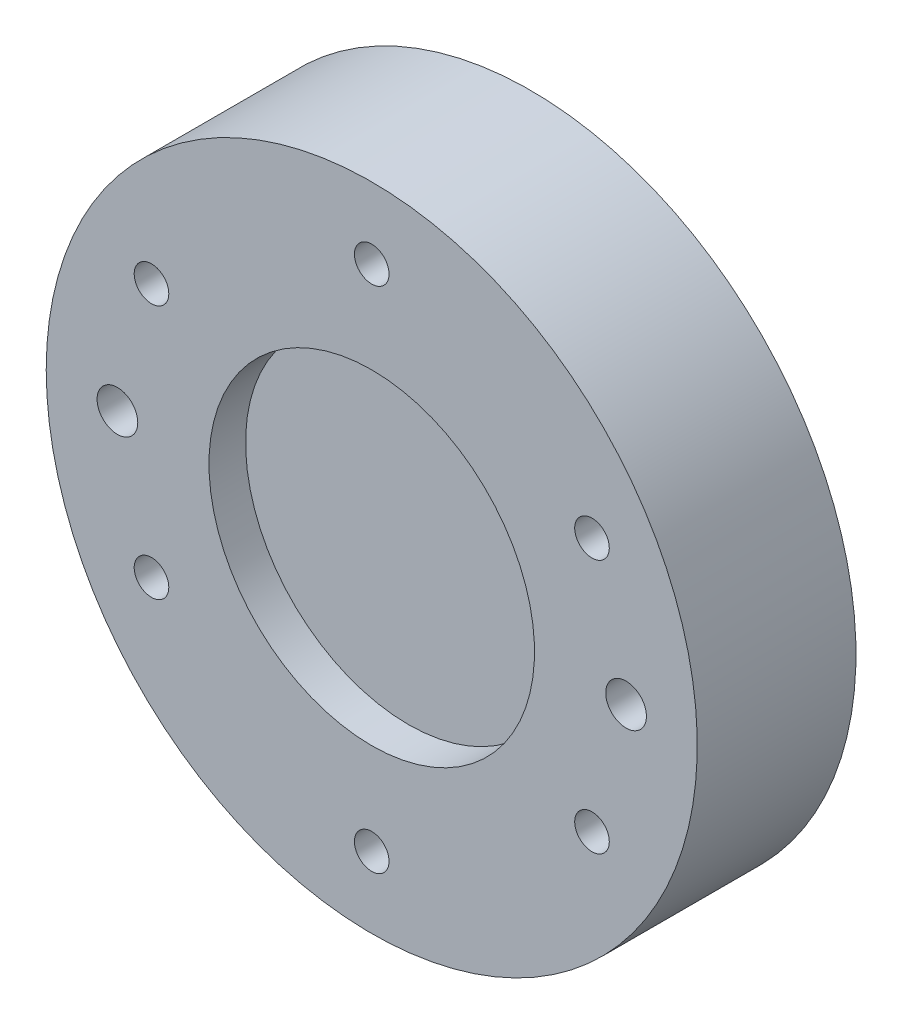
ISO-10303-21;
HEADER;
FILE_DESCRIPTION(('STEP AP214'),'2;1');
FILE_NAME('part.step','',(''),(''),'','','');
FILE_SCHEMA(('AUTOMOTIVE_DESIGN { 1 0 10303 214 1 1 1 1 }'));
ENDSEC;
DATA;
#1=APPLICATION_CONTEXT('core data for automotive mechanical design processes');
#2=APPLICATION_PROTOCOL_DEFINITION('international standard','automotive_design',2000,#1);
#3=PRODUCT_CONTEXT('',#1,'mechanical');
#4=PRODUCT('Part','Part','',(#3));
#5=PRODUCT_RELATED_PRODUCT_CATEGORY('part','',(#4));
#6=PRODUCT_DEFINITION_FORMATION('','',#4);
#7=PRODUCT_DEFINITION_CONTEXT('part definition',#1,'design');
#8=PRODUCT_DEFINITION('design','',#6,#7);
#9=PRODUCT_DEFINITION_SHAPE('','',#8);
#10=(LENGTH_UNIT() NAMED_UNIT(*) SI_UNIT(.MILLI.,.METRE.));
#11=(NAMED_UNIT(*) PLANE_ANGLE_UNIT() SI_UNIT($,.RADIAN.));
#12=(NAMED_UNIT(*) SI_UNIT($,.STERADIAN.) SOLID_ANGLE_UNIT());
#13=UNCERTAINTY_MEASURE_WITH_UNIT(LENGTH_MEASURE(1.E-05),#10,'distance_accuracy_value','');
#14=(GEOMETRIC_REPRESENTATION_CONTEXT(3) GLOBAL_UNCERTAINTY_ASSIGNED_CONTEXT((#13)) GLOBAL_UNIT_ASSIGNED_CONTEXT((#10,
#11,#12)) REPRESENTATION_CONTEXT('',''));
#15=CARTESIAN_POINT('',(0.,0.,0.));
#16=DIRECTION('',(0.,0.,1.));
#17=DIRECTION('',(1.,0.,0.));
#18=AXIS2_PLACEMENT_3D('',#15,#16,#17);
#19=CARTESIAN_POINT('',(-41.6,-41.64168028405,30.));
#20=DIRECTION('',(0.,0.,1.));
#21=DIRECTION('',(1.,0.,0.));
#22=AXIS2_PLACEMENT_3D('',#19,#20,#21);
#23=PLANE('',#22);
#24=CARTESIAN_POINT('',(0.,0.,29.9999999999961));
#25=DIRECTION('',(0.,0.,1.));
#26=DIRECTION('',(0.,-1.,0.));
#27=AXIS2_PLACEMENT_3D('',#24,#25,#26);
#28=CIRCLE('',#27,40.);
#29=CARTESIAN_POINT('',(0.,-40.,29.9999999999961));
#30=VERTEX_POINT('',#29);
#31=EDGE_CURVE('P0_E18',#30,#30,#28,.F.);
#32=ORIENTED_EDGE('',*,*,#31,.F.);
#33=EDGE_LOOP('',(#32));
#34=FACE_BOUND('',#33,.T.);
#35=ADVANCED_FACE('P0_F14',(#34),#23,.T.);
#36=CARTESIAN_POINT('',(-70.2,-5.289838914043,19.));
#37=DIRECTION('',(0.,0.,1.));
#38=DIRECTION('',(1.,0.,0.));
#39=AXIS2_PLACEMENT_3D('',#36,#37,#38);
#40=PLANE('',#39);
#41=CARTESIAN_POINT('',(62.5,0.,19.));
#42=DIRECTION('',(0.,0.,1.));
#43=DIRECTION('',(1.,0.,0.));
#44=AXIS2_PLACEMENT_3D('',#41,#42,#43);
#45=CIRCLE('',#44,5.);
#46=CARTESIAN_POINT('',(67.5,0.,19.));
#47=VERTEX_POINT('',#46);
#48=EDGE_CURVE('P0_E76',#47,#47,#45,.F.);
#49=ORIENTED_EDGE('',*,*,#48,.F.);
#50=EDGE_LOOP('',(#49));
#51=FACE_BOUND('',#50,.T.);
#52=ADVANCED_FACE('P0_F87',(#51),#40,.T.);
#53=CARTESIAN_POINT('',(-70.2,-5.289838914043,19.));
#54=DIRECTION('',(0.,0.,1.));
#55=DIRECTION('',(1.,0.,0.));
#56=AXIS2_PLACEMENT_3D('',#53,#54,#55);
#57=PLANE('',#56);
#58=CARTESIAN_POINT('',(-62.5,0.,19.));
#59=DIRECTION('',(0.,0.,1.));
#60=DIRECTION('',(1.,0.,0.));
#61=AXIS2_PLACEMENT_3D('',#58,#59,#60);
#62=CIRCLE('',#61,5.);
#63=CARTESIAN_POINT('',(-57.5,0.,19.));
#64=VERTEX_POINT('',#63);
#65=EDGE_CURVE('P0_E74',#64,#64,#62,.F.);
#66=ORIENTED_EDGE('',*,*,#65,.F.);
#67=EDGE_LOOP('',(#66));
#68=FACE_BOUND('',#67,.T.);
#69=ADVANCED_FACE('P0_F93',(#68),#57,.T.);
#70=CARTESIAN_POINT('',(-60.71165124599,-69.42,19.));
#71=DIRECTION('',(0.,0.,1.));
#72=DIRECTION('',(1.,0.,0.));
#73=AXIS2_PLACEMENT_3D('',#70,#71,#72);
#74=PLANE('',#73);
#75=CARTESIAN_POINT('',(54.12658773653,31.25,19.));
#76=DIRECTION('',(0.,0.,1.));
#77=DIRECTION('',(1.,0.,0.));
#78=AXIS2_PLACEMENT_3D('',#75,#76,#77);
#79=CIRCLE('',#78,4.25);
#80=CARTESIAN_POINT('',(58.37658773653,31.25,19.));
#81=VERTEX_POINT('',#80);
#82=EDGE_CURVE('P0_E71',#81,#81,#79,.F.);
#83=ORIENTED_EDGE('',*,*,#82,.F.);
#84=EDGE_LOOP('',(#83));
#85=FACE_BOUND('',#84,.T.);
#86=ADVANCED_FACE('P0_F168',(#85),#74,.T.);
#87=CARTESIAN_POINT('',(-60.71165124599,-69.42,19.));
#88=DIRECTION('',(0.,0.,1.));
#89=DIRECTION('',(1.,0.,0.));
#90=AXIS2_PLACEMENT_3D('',#87,#88,#89);
#91=PLANE('',#90);
#92=CARTESIAN_POINT('',(0.,62.5,19.));
#93=DIRECTION('',(0.,0.,1.));
#94=DIRECTION('',(1.,0.,0.));
#95=AXIS2_PLACEMENT_3D('',#92,#93,#94);
#96=CIRCLE('',#95,4.25);
#97=CARTESIAN_POINT('',(4.25,62.5,19.));
#98=VERTEX_POINT('',#97);
#99=EDGE_CURVE('P0_E68',#98,#98,#96,.F.);
#100=ORIENTED_EDGE('',*,*,#99,.F.);
#101=EDGE_LOOP('',(#100));
#102=FACE_BOUND('',#101,.T.);
#103=ADVANCED_FACE('P0_F164',(#102),#91,.T.);
#104=CARTESIAN_POINT('',(-60.71165124599,-69.42,19.));
#105=DIRECTION('',(0.,0.,1.));
#106=DIRECTION('',(1.,0.,0.));
#107=AXIS2_PLACEMENT_3D('',#104,#105,#106);
#108=PLANE('',#107);
#109=CARTESIAN_POINT('',(-54.12658773653,31.25,19.));
#110=DIRECTION('',(0.,0.,1.));
#111=DIRECTION('',(1.,0.,0.));
#112=AXIS2_PLACEMENT_3D('',#109,#110,#111);
#113=CIRCLE('',#112,4.25);
#114=CARTESIAN_POINT('',(-49.87658773653,31.25,19.));
#115=VERTEX_POINT('',#114);
#116=EDGE_CURVE('P0_E65',#115,#115,#113,.F.);
#117=ORIENTED_EDGE('',*,*,#116,.F.);
#118=EDGE_LOOP('',(#117));
#119=FACE_BOUND('',#118,.T.);
#120=ADVANCED_FACE('P0_F160',(#119),#108,.T.);
#121=CARTESIAN_POINT('',(-60.71165124599,-69.42,19.));
#122=DIRECTION('',(0.,0.,1.));
#123=DIRECTION('',(1.,0.,0.));
#124=AXIS2_PLACEMENT_3D('',#121,#122,#123);
#125=PLANE('',#124);
#126=CARTESIAN_POINT('',(-54.12658773653,-31.25,19.));
#127=DIRECTION('',(0.,0.,1.));
#128=DIRECTION('',(1.,0.,0.));
#129=AXIS2_PLACEMENT_3D('',#126,#127,#128);
#130=CIRCLE('',#129,4.25);
#131=CARTESIAN_POINT('',(-49.87658773653,-31.25,19.));
#132=VERTEX_POINT('',#131);
#133=EDGE_CURVE('P0_E62',#132,#132,#130,.F.);
#134=ORIENTED_EDGE('',*,*,#133,.F.);
#135=EDGE_LOOP('',(#134));
#136=FACE_BOUND('',#135,.T.);
#137=ADVANCED_FACE('P0_F153',(#136),#125,.T.);
#138=CARTESIAN_POINT('',(-60.71165124599,-69.42,19.));
#139=DIRECTION('',(0.,0.,1.));
#140=DIRECTION('',(1.,0.,0.));
#141=AXIS2_PLACEMENT_3D('',#138,#139,#140);
#142=PLANE('',#141);
#143=CARTESIAN_POINT('',(0.,-62.5,19.));
#144=DIRECTION('',(0.,0.,1.));
#145=DIRECTION('',(1.,0.,0.));
#146=AXIS2_PLACEMENT_3D('',#143,#144,#145);
#147=CIRCLE('',#146,4.25);
#148=CARTESIAN_POINT('',(4.25,-62.5,19.));
#149=VERTEX_POINT('',#148);
#150=EDGE_CURVE('P0_E59',#149,#149,#147,.F.);
#151=ORIENTED_EDGE('',*,*,#150,.F.);
#152=EDGE_LOOP('',(#151));
#153=FACE_BOUND('',#152,.T.);
#154=ADVANCED_FACE('P0_F147',(#153),#142,.T.);
#155=CARTESIAN_POINT('',(-60.71165124599,-69.42,19.));
#156=DIRECTION('',(0.,0.,1.));
#157=DIRECTION('',(1.,0.,0.));
#158=AXIS2_PLACEMENT_3D('',#155,#156,#157);
#159=PLANE('',#158);
#160=CARTESIAN_POINT('',(54.12658773653,-31.25,19.));
#161=DIRECTION('',(0.,0.,1.));
#162=DIRECTION('',(1.,0.,0.));
#163=AXIS2_PLACEMENT_3D('',#160,#161,#162);
#164=CIRCLE('',#163,4.25);
#165=CARTESIAN_POINT('',(58.37658773653,-31.25,19.));
#166=VERTEX_POINT('',#165);
#167=EDGE_CURVE('P0_E56',#166,#166,#164,.F.);
#168=ORIENTED_EDGE('',*,*,#167,.F.);
#169=EDGE_LOOP('',(#168));
#170=FACE_BOUND('',#169,.T.);
#171=ADVANCED_FACE('P0_F143',(#170),#159,.T.);
#172=CARTESIAN_POINT('',(0.,0.,29.9999999999961));
#173=DIRECTION('',(0.,0.,1.));
#174=DIRECTION('',(0.,-1.,0.));
#175=AXIS2_PLACEMENT_3D('',#172,#173,#174);
#176=CYLINDRICAL_SURFACE('',#175,40.);
#177=ORIENTED_EDGE('',*,*,#31,.T.);
#178=EDGE_LOOP('',(#177));
#179=FACE_BOUND('',#178,.T.);
#180=CARTESIAN_POINT('',(0.,0.,39.0000000000042));
#181=DIRECTION('',(0.,0.,1.));
#182=DIRECTION('',(0.,-1.,0.));
#183=AXIS2_PLACEMENT_3D('',#180,#181,#182);
#184=CIRCLE('',#183,40.);
#185=CARTESIAN_POINT('',(0.,-40.,39.0000000000042));
#186=VERTEX_POINT('',#185);
#187=EDGE_CURVE('P0_E53',#186,#186,#184,.T.);
#188=ORIENTED_EDGE('',*,*,#187,.T.);
#189=EDGE_LOOP('',(#188));
#190=FACE_BOUND('',#189,.T.);
#191=ADVANCED_FACE('P0_F83',(#179,#190),#176,.F.);
#192=CARTESIAN_POINT('',(62.5,0.,19.));
#193=DIRECTION('',(0.,0.,1.));
#194=DIRECTION('',(1.,0.,0.));
#195=AXIS2_PLACEMENT_3D('',#192,#193,#194);
#196=CYLINDRICAL_SURFACE('',#195,5.);
#197=ORIENTED_EDGE('',*,*,#48,.T.);
#198=EDGE_LOOP('',(#197));
#199=FACE_BOUND('',#198,.T.);
#200=CARTESIAN_POINT('',(62.5,0.,38.9999999999994));
#201=DIRECTION('',(0.,0.,1.));
#202=DIRECTION('',(1.,0.,0.));
#203=AXIS2_PLACEMENT_3D('',#200,#201,#202);
#204=CIRCLE('',#203,5.);
#205=CARTESIAN_POINT('',(67.5,0.,38.9999999999994));
#206=VERTEX_POINT('',#205);
#207=EDGE_CURVE('P0_E50',#206,#206,#204,.T.);
#208=ORIENTED_EDGE('',*,*,#207,.T.);
#209=EDGE_LOOP('',(#208));
#210=FACE_BOUND('',#209,.T.);
#211=ADVANCED_FACE('P0_F138',(#199,#210),#196,.F.);
#212=CARTESIAN_POINT('',(-62.5,0.,19.));
#213=DIRECTION('',(0.,0.,1.));
#214=DIRECTION('',(1.,0.,0.));
#215=AXIS2_PLACEMENT_3D('',#212,#213,#214);
#216=CYLINDRICAL_SURFACE('',#215,5.);
#217=ORIENTED_EDGE('',*,*,#65,.T.);
#218=EDGE_LOOP('',(#217));
#219=FACE_BOUND('',#218,.T.);
#220=CARTESIAN_POINT('',(-62.5,0.,38.9999999999994));
#221=DIRECTION('',(0.,0.,1.));
#222=DIRECTION('',(1.,0.,0.));
#223=AXIS2_PLACEMENT_3D('',#220,#221,#222);
#224=CIRCLE('',#223,5.);
#225=CARTESIAN_POINT('',(-57.5,0.,38.9999999999994));
#226=VERTEX_POINT('',#225);
#227=EDGE_CURVE('P0_E47',#226,#226,#224,.T.);
#228=ORIENTED_EDGE('',*,*,#227,.T.);
#229=EDGE_LOOP('',(#228));
#230=FACE_BOUND('',#229,.T.);
#231=ADVANCED_FACE('P0_F134',(#219,#230),#216,.F.);
#232=CARTESIAN_POINT('',(54.12658773653,31.25,19.));
#233=DIRECTION('',(0.,0.,1.));
#234=DIRECTION('',(1.,0.,0.));
#235=AXIS2_PLACEMENT_3D('',#232,#233,#234);
#236=CYLINDRICAL_SURFACE('',#235,4.25);
#237=ORIENTED_EDGE('',*,*,#82,.T.);
#238=EDGE_LOOP('',(#237));
#239=FACE_BOUND('',#238,.T.);
#240=CARTESIAN_POINT('',(54.12658773653,31.25,38.9999999999994));
#241=DIRECTION('',(0.,0.,1.));
#242=DIRECTION('',(1.,0.,0.));
#243=AXIS2_PLACEMENT_3D('',#240,#241,#242);
#244=CIRCLE('',#243,4.25);
#245=CARTESIAN_POINT('',(58.37658773653,31.25,38.9999999999994));
#246=VERTEX_POINT('',#245);
#247=EDGE_CURVE('P0_E44',#246,#246,#244,.T.);
#248=ORIENTED_EDGE('',*,*,#247,.T.);
#249=EDGE_LOOP('',(#248));
#250=FACE_BOUND('',#249,.T.);
#251=ADVANCED_FACE('P0_F130',(#239,#250),#236,.F.);
#252=CARTESIAN_POINT('',(0.,62.5,19.));
#253=DIRECTION('',(0.,0.,1.));
#254=DIRECTION('',(1.,0.,0.));
#255=AXIS2_PLACEMENT_3D('',#252,#253,#254);
#256=CYLINDRICAL_SURFACE('',#255,4.25);
#257=ORIENTED_EDGE('',*,*,#99,.T.);
#258=EDGE_LOOP('',(#257));
#259=FACE_BOUND('',#258,.T.);
#260=CARTESIAN_POINT('',(0.,62.5,38.9999999999994));
#261=DIRECTION('',(0.,0.,1.));
#262=DIRECTION('',(1.,0.,0.));
#263=AXIS2_PLACEMENT_3D('',#260,#261,#262);
#264=CIRCLE('',#263,4.25);
#265=CARTESIAN_POINT('',(4.25,62.5,38.9999999999994));
#266=VERTEX_POINT('',#265);
#267=EDGE_CURVE('P0_E41',#266,#266,#264,.T.);
#268=ORIENTED_EDGE('',*,*,#267,.T.);
#269=EDGE_LOOP('',(#268));
#270=FACE_BOUND('',#269,.T.);
#271=ADVANCED_FACE('P0_F126',(#259,#270),#256,.F.);
#272=CARTESIAN_POINT('',(-54.12658773653,31.25,19.));
#273=DIRECTION('',(0.,0.,1.));
#274=DIRECTION('',(1.,0.,0.));
#275=AXIS2_PLACEMENT_3D('',#272,#273,#274);
#276=CYLINDRICAL_SURFACE('',#275,4.25);
#277=ORIENTED_EDGE('',*,*,#116,.T.);
#278=EDGE_LOOP('',(#277));
#279=FACE_BOUND('',#278,.T.);
#280=CARTESIAN_POINT('',(-54.12658773653,31.25,38.9999999999994));
#281=DIRECTION('',(0.,0.,1.));
#282=DIRECTION('',(1.,0.,0.));
#283=AXIS2_PLACEMENT_3D('',#280,#281,#282);
#284=CIRCLE('',#283,4.25);
#285=CARTESIAN_POINT('',(-49.87658773653,31.25,38.9999999999994));
#286=VERTEX_POINT('',#285);
#287=EDGE_CURVE('P0_E38',#286,#286,#284,.T.);
#288=ORIENTED_EDGE('',*,*,#287,.T.);
#289=EDGE_LOOP('',(#288));
#290=FACE_BOUND('',#289,.T.);
#291=ADVANCED_FACE('P0_F122',(#279,#290),#276,.F.);
#292=CARTESIAN_POINT('',(-54.12658773653,-31.25,19.));
#293=DIRECTION('',(0.,0.,1.));
#294=DIRECTION('',(1.,0.,0.));
#295=AXIS2_PLACEMENT_3D('',#292,#293,#294);
#296=CYLINDRICAL_SURFACE('',#295,4.25);
#297=ORIENTED_EDGE('',*,*,#133,.T.);
#298=EDGE_LOOP('',(#297));
#299=FACE_BOUND('',#298,.T.);
#300=CARTESIAN_POINT('',(-54.12658773653,-31.25,38.9999999999994));
#301=DIRECTION('',(0.,0.,1.));
#302=DIRECTION('',(1.,0.,0.));
#303=AXIS2_PLACEMENT_3D('',#300,#301,#302);
#304=CIRCLE('',#303,4.25);
#305=CARTESIAN_POINT('',(-49.87658773653,-31.25,38.9999999999994));
#306=VERTEX_POINT('',#305);
#307=EDGE_CURVE('P0_E35',#306,#306,#304,.T.);
#308=ORIENTED_EDGE('',*,*,#307,.T.);
#309=EDGE_LOOP('',(#308));
#310=FACE_BOUND('',#309,.T.);
#311=ADVANCED_FACE('P0_F118',(#299,#310),#296,.F.);
#312=CARTESIAN_POINT('',(0.,-62.5,19.));
#313=DIRECTION('',(0.,0.,1.));
#314=DIRECTION('',(1.,0.,0.));
#315=AXIS2_PLACEMENT_3D('',#312,#313,#314);
#316=CYLINDRICAL_SURFACE('',#315,4.25);
#317=ORIENTED_EDGE('',*,*,#150,.T.);
#318=EDGE_LOOP('',(#317));
#319=FACE_BOUND('',#318,.T.);
#320=CARTESIAN_POINT('',(0.,-62.5,38.9999999999994));
#321=DIRECTION('',(0.,0.,1.));
#322=DIRECTION('',(1.,0.,0.));
#323=AXIS2_PLACEMENT_3D('',#320,#321,#322);
#324=CIRCLE('',#323,4.25);
#325=CARTESIAN_POINT('',(4.25,-62.5,38.9999999999994));
#326=VERTEX_POINT('',#325);
#327=EDGE_CURVE('P0_E32',#326,#326,#324,.T.);
#328=ORIENTED_EDGE('',*,*,#327,.T.);
#329=EDGE_LOOP('',(#328));
#330=FACE_BOUND('',#329,.T.);
#331=ADVANCED_FACE('P0_F114',(#319,#330),#316,.F.);
#332=CARTESIAN_POINT('',(54.12658773653,-31.25,19.));
#333=DIRECTION('',(0.,0.,1.));
#334=DIRECTION('',(1.,0.,0.));
#335=AXIS2_PLACEMENT_3D('',#332,#333,#334);
#336=CYLINDRICAL_SURFACE('',#335,4.25);
#337=ORIENTED_EDGE('',*,*,#167,.T.);
#338=EDGE_LOOP('',(#337));
#339=FACE_BOUND('',#338,.T.);
#340=CARTESIAN_POINT('',(54.12658773653,-31.25,38.9999999999994));
#341=DIRECTION('',(0.,0.,1.));
#342=DIRECTION('',(1.,0.,0.));
#343=AXIS2_PLACEMENT_3D('',#340,#341,#342);
#344=CIRCLE('',#343,4.25);
#345=CARTESIAN_POINT('',(58.37658773653,-31.25,38.9999999999994));
#346=VERTEX_POINT('',#345);
#347=EDGE_CURVE('P0_E27',#346,#346,#344,.T.);
#348=ORIENTED_EDGE('',*,*,#347,.T.);
#349=EDGE_LOOP('',(#348));
#350=FACE_BOUND('',#349,.T.);
#351=ADVANCED_FACE('P0_F107',(#339,#350),#336,.F.);
#352=CARTESIAN_POINT('',(83.22806315155,83.2,39.));
#353=DIRECTION('',(0.,0.,-1.));
#354=DIRECTION('',(0.,-1.,0.));
#355=AXIS2_PLACEMENT_3D('',#352,#353,#354);
#356=PLANE('',#355);
#357=ORIENTED_EDGE('',*,*,#347,.F.);
#358=EDGE_LOOP('',(#357));
#359=FACE_BOUND('',#358,.T.);
#360=ORIENTED_EDGE('',*,*,#327,.F.);
#361=EDGE_LOOP('',(#360));
#362=FACE_BOUND('',#361,.T.);
#363=ORIENTED_EDGE('',*,*,#307,.F.);
#364=EDGE_LOOP('',(#363));
#365=FACE_BOUND('',#364,.T.);
#366=ORIENTED_EDGE('',*,*,#287,.F.);
#367=EDGE_LOOP('',(#366));
#368=FACE_BOUND('',#367,.T.);
#369=ORIENTED_EDGE('',*,*,#267,.F.);
#370=EDGE_LOOP('',(#369));
#371=FACE_BOUND('',#370,.T.);
#372=ORIENTED_EDGE('',*,*,#247,.F.);
#373=EDGE_LOOP('',(#372));
#374=FACE_BOUND('',#373,.T.);
#375=ORIENTED_EDGE('',*,*,#227,.F.);
#376=EDGE_LOOP('',(#375));
#377=FACE_BOUND('',#376,.T.);
#378=ORIENTED_EDGE('',*,*,#207,.F.);
#379=EDGE_LOOP('',(#378));
#380=FACE_BOUND('',#379,.T.);
#381=ORIENTED_EDGE('',*,*,#187,.F.);
#382=EDGE_LOOP('',(#381));
#383=FACE_BOUND('',#382,.T.);
#384=CARTESIAN_POINT('',(0.,0.,39.));
#385=DIRECTION('',(0.,0.,-1.));
#386=DIRECTION('',(-1.,0.,0.));
#387=AXIS2_PLACEMENT_3D('',#384,#385,#386);
#388=CIRCLE('',#387,80.);
#389=CARTESIAN_POINT('',(-80.,0.,39.));
#390=VERTEX_POINT('',#389);
#391=EDGE_CURVE('P0_E22',#390,#390,#388,.F.);
#392=ORIENTED_EDGE('',*,*,#391,.T.);
#393=EDGE_LOOP('',(#392));
#394=FACE_BOUND('',#393,.T.);
#395=ADVANCED_FACE('P0_F102',(#359,#362,#365,#368,#371,#374,#377,#380,#383,#394),#356,.F.);
#396=CARTESIAN_POINT('',(0.,0.,39.));
#397=DIRECTION('',(0.,0.,-1.));
#398=DIRECTION('',(-1.,0.,0.));
#399=AXIS2_PLACEMENT_3D('',#396,#397,#398);
#400=CYLINDRICAL_SURFACE('',#399,80.);
#401=ORIENTED_EDGE('',*,*,#391,.F.);
#402=EDGE_LOOP('',(#401));
#403=FACE_BOUND('',#402,.T.);
#404=CARTESIAN_POINT('',(0.,0.,1.24206200879939E-12));
#405=DIRECTION('',(0.,0.,-1.));
#406=DIRECTION('',(-1.,0.,0.));
#407=AXIS2_PLACEMENT_3D('',#404,#405,#406);
#408=CIRCLE('',#407,80.);
#409=CARTESIAN_POINT('',(-80.,0.,1.24206200879939E-12));
#410=VERTEX_POINT('',#409);
#411=EDGE_CURVE('P0_E10',#410,#410,#408,.T.);
#412=ORIENTED_EDGE('',*,*,#411,.F.);
#413=EDGE_LOOP('',(#412));
#414=FACE_BOUND('',#413,.T.);
#415=ADVANCED_FACE('P0_F98',(#403,#414),#400,.T.);
#416=CARTESIAN_POINT('',(83.22806315155,83.2,0.));
#417=DIRECTION('',(0.,0.,-1.));
#418=DIRECTION('',(0.,-1.,0.));
#419=AXIS2_PLACEMENT_3D('',#416,#417,#418);
#420=PLANE('',#419);
#421=ORIENTED_EDGE('',*,*,#411,.T.);
#422=EDGE_LOOP('',(#421));
#423=FACE_BOUND('',#422,.T.);
#424=ADVANCED_FACE('P0_F16',(#423),#420,.T.);
#425=CLOSED_SHELL('',(#35,#52,#69,#86,#103,#120,#137,#154,#171,#191,#211,#231,#251,#271,#291,
#311,#331,#351,#395,#415,#424));
#426=MANIFOLD_SOLID_BREP('P0_B1',#425);
#427=CARTESIAN_POINT('',(54.12658773653,31.25,39.));
#428=DIRECTION('',(0.,0.,-1.));
#429=DIRECTION('',(-1.,0.,0.));
#430=AXIS2_PLACEMENT_3D('',#427,#428,#429);
#431=CYLINDRICAL_SURFACE('',#430,5.);
#432=CARTESIAN_POINT('',(54.12658773653,31.25,19.0000000000006));
#433=DIRECTION('',(0.,0.,-1.));
#434=DIRECTION('',(-1.,0.,0.));
#435=AXIS2_PLACEMENT_3D('',#432,#433,#434);
#436=CIRCLE('',#435,5.);
#437=CARTESIAN_POINT('',(49.12658773653,31.25,19.0000000000006));
#438=VERTEX_POINT('',#437);
#439=EDGE_CURVE('P1_E18',#438,#438,#436,.T.);
#440=ORIENTED_EDGE('',*,*,#439,.T.);
#441=EDGE_LOOP('',(#440));
#442=FACE_BOUND('',#441,.T.);
#443=CARTESIAN_POINT('',(54.12658773653,31.25,39.));
#444=DIRECTION('',(0.,0.,-1.));
#445=DIRECTION('',(-1.,0.,0.));
#446=AXIS2_PLACEMENT_3D('',#443,#444,#445);
#447=CIRCLE('',#446,5.);
#448=CARTESIAN_POINT('',(49.12658773653,31.25,39.));
#449=VERTEX_POINT('',#448);
#450=EDGE_CURVE('P1_E10',#449,#449,#447,.F.);
#451=ORIENTED_EDGE('',*,*,#450,.T.);
#452=EDGE_LOOP('',(#451));
#453=FACE_BOUND('',#452,.T.);
#454=ADVANCED_FACE('P1_F14',(#442,#453),#431,.F.);
#455=OPEN_SHELL('',(#454));
#456=SHELL_BASED_SURFACE_MODEL('P1_B1',(#455));
#457=CARTESIAN_POINT('',(54.12658773653,-31.25,39.));
#458=DIRECTION('',(0.,0.,-1.));
#459=DIRECTION('',(-1.,0.,0.));
#460=AXIS2_PLACEMENT_3D('',#457,#458,#459);
#461=CYLINDRICAL_SURFACE('',#460,5.);
#462=CARTESIAN_POINT('',(54.12658773653,-31.25,19.0000000000006));
#463=DIRECTION('',(0.,0.,-1.));
#464=DIRECTION('',(-1.,0.,0.));
#465=AXIS2_PLACEMENT_3D('',#462,#463,#464);
#466=CIRCLE('',#465,5.);
#467=CARTESIAN_POINT('',(49.12658773653,-31.25,19.0000000000006));
#468=VERTEX_POINT('',#467);
#469=EDGE_CURVE('P2_E18',#468,#468,#466,.T.);
#470=ORIENTED_EDGE('',*,*,#469,.T.);
#471=EDGE_LOOP('',(#470));
#472=FACE_BOUND('',#471,.T.);
#473=CARTESIAN_POINT('',(54.12658773653,-31.25,39.));
#474=DIRECTION('',(0.,0.,-1.));
#475=DIRECTION('',(-1.,0.,0.));
#476=AXIS2_PLACEMENT_3D('',#473,#474,#475);
#477=CIRCLE('',#476,5.);
#478=CARTESIAN_POINT('',(49.12658773653,-31.25,39.));
#479=VERTEX_POINT('',#478);
#480=EDGE_CURVE('P2_E10',#479,#479,#477,.F.);
#481=ORIENTED_EDGE('',*,*,#480,.T.);
#482=EDGE_LOOP('',(#481));
#483=FACE_BOUND('',#482,.T.);
#484=ADVANCED_FACE('P2_F14',(#472,#483),#461,.F.);
#485=OPEN_SHELL('',(#484));
#486=SHELL_BASED_SURFACE_MODEL('P2_B1',(#485));
#487=CARTESIAN_POINT('',(0.,-62.5,39.));
#488=DIRECTION('',(0.,0.,-1.));
#489=DIRECTION('',(-1.,0.,0.));
#490=AXIS2_PLACEMENT_3D('',#487,#488,#489);
#491=CYLINDRICAL_SURFACE('',#490,5.);
#492=CARTESIAN_POINT('',(0.,-62.5,19.0000000000006));
#493=DIRECTION('',(0.,0.,-1.));
#494=DIRECTION('',(-1.,0.,0.));
#495=AXIS2_PLACEMENT_3D('',#492,#493,#494);
#496=CIRCLE('',#495,5.);
#497=CARTESIAN_POINT('',(-5.,-62.5,19.0000000000006));
#498=VERTEX_POINT('',#497);
#499=EDGE_CURVE('P3_E18',#498,#498,#496,.T.);
#500=ORIENTED_EDGE('',*,*,#499,.T.);
#501=EDGE_LOOP('',(#500));
#502=FACE_BOUND('',#501,.T.);
#503=CARTESIAN_POINT('',(0.,-62.5,39.));
#504=DIRECTION('',(0.,0.,-1.));
#505=DIRECTION('',(-1.,0.,0.));
#506=AXIS2_PLACEMENT_3D('',#503,#504,#505);
#507=CIRCLE('',#506,5.);
#508=CARTESIAN_POINT('',(-5.,-62.5,39.));
#509=VERTEX_POINT('',#508);
#510=EDGE_CURVE('P3_E10',#509,#509,#507,.F.);
#511=ORIENTED_EDGE('',*,*,#510,.T.);
#512=EDGE_LOOP('',(#511));
#513=FACE_BOUND('',#512,.T.);
#514=ADVANCED_FACE('P3_F14',(#502,#513),#491,.F.);
#515=OPEN_SHELL('',(#514));
#516=SHELL_BASED_SURFACE_MODEL('P3_B1',(#515));
#517=CARTESIAN_POINT('',(-54.12658773653,-31.25,39.));
#518=DIRECTION('',(0.,0.,-1.));
#519=DIRECTION('',(-1.,0.,0.));
#520=AXIS2_PLACEMENT_3D('',#517,#518,#519);
#521=CYLINDRICAL_SURFACE('',#520,5.);
#522=CARTESIAN_POINT('',(-54.12658773653,-31.25,19.0000000000006));
#523=DIRECTION('',(0.,0.,-1.));
#524=DIRECTION('',(-1.,0.,0.));
#525=AXIS2_PLACEMENT_3D('',#522,#523,#524);
#526=CIRCLE('',#525,4.99999999999999);
#527=CARTESIAN_POINT('',(-59.12658773653,-31.25,19.0000000000006));
#528=VERTEX_POINT('',#527);
#529=EDGE_CURVE('P4_E18',#528,#528,#526,.T.);
#530=ORIENTED_EDGE('',*,*,#529,.T.);
#531=EDGE_LOOP('',(#530));
#532=FACE_BOUND('',#531,.T.);
#533=CARTESIAN_POINT('',(-54.12658773653,-31.25,39.));
#534=DIRECTION('',(0.,0.,-1.));
#535=DIRECTION('',(-1.,0.,0.));
#536=AXIS2_PLACEMENT_3D('',#533,#534,#535);
#537=CIRCLE('',#536,5.);
#538=CARTESIAN_POINT('',(-59.12658773653,-31.25,39.));
#539=VERTEX_POINT('',#538);
#540=EDGE_CURVE('P4_E10',#539,#539,#537,.F.);
#541=ORIENTED_EDGE('',*,*,#540,.T.);
#542=EDGE_LOOP('',(#541));
#543=FACE_BOUND('',#542,.T.);
#544=ADVANCED_FACE('P4_F14',(#532,#543),#521,.F.);
#545=OPEN_SHELL('',(#544));
#546=SHELL_BASED_SURFACE_MODEL('P4_B1',(#545));
#547=CARTESIAN_POINT('',(-54.12658773653,31.25,39.));
#548=DIRECTION('',(0.,0.,-1.));
#549=DIRECTION('',(-1.,0.,0.));
#550=AXIS2_PLACEMENT_3D('',#547,#548,#549);
#551=CYLINDRICAL_SURFACE('',#550,5.);
#552=CARTESIAN_POINT('',(-54.12658773653,31.25,19.0000000000006));
#553=DIRECTION('',(0.,0.,-1.));
#554=DIRECTION('',(-1.,0.,0.));
#555=AXIS2_PLACEMENT_3D('',#552,#553,#554);
#556=CIRCLE('',#555,4.99999999999999);
#557=CARTESIAN_POINT('',(-59.12658773653,31.25,19.0000000000006));
#558=VERTEX_POINT('',#557);
#559=EDGE_CURVE('P5_E18',#558,#558,#556,.T.);
#560=ORIENTED_EDGE('',*,*,#559,.T.);
#561=EDGE_LOOP('',(#560));
#562=FACE_BOUND('',#561,.T.);
#563=CARTESIAN_POINT('',(-54.12658773653,31.25,39.));
#564=DIRECTION('',(0.,0.,-1.));
#565=DIRECTION('',(-1.,0.,0.));
#566=AXIS2_PLACEMENT_3D('',#563,#564,#565);
#567=CIRCLE('',#566,5.);
#568=CARTESIAN_POINT('',(-59.12658773653,31.25,39.));
#569=VERTEX_POINT('',#568);
#570=EDGE_CURVE('P5_E10',#569,#569,#567,.F.);
#571=ORIENTED_EDGE('',*,*,#570,.T.);
#572=EDGE_LOOP('',(#571));
#573=FACE_BOUND('',#572,.T.);
#574=ADVANCED_FACE('P5_F14',(#562,#573),#551,.F.);
#575=OPEN_SHELL('',(#574));
#576=SHELL_BASED_SURFACE_MODEL('P5_B1',(#575));
#577=CARTESIAN_POINT('',(0.,62.5,39.));
#578=DIRECTION('',(0.,0.,-1.));
#579=DIRECTION('',(-1.,0.,0.));
#580=AXIS2_PLACEMENT_3D('',#577,#578,#579);
#581=CYLINDRICAL_SURFACE('',#580,5.);
#582=CARTESIAN_POINT('',(0.,62.5,19.0000000000006));
#583=DIRECTION('',(0.,0.,-1.));
#584=DIRECTION('',(-1.,0.,0.));
#585=AXIS2_PLACEMENT_3D('',#582,#583,#584);
#586=CIRCLE('',#585,5.);
#587=CARTESIAN_POINT('',(-5.,62.5,19.0000000000006));
#588=VERTEX_POINT('',#587);
#589=EDGE_CURVE('P6_E18',#588,#588,#586,.T.);
#590=ORIENTED_EDGE('',*,*,#589,.T.);
#591=EDGE_LOOP('',(#590));
#592=FACE_BOUND('',#591,.T.);
#593=CARTESIAN_POINT('',(0.,62.5,39.));
#594=DIRECTION('',(0.,0.,-1.));
#595=DIRECTION('',(-1.,0.,0.));
#596=AXIS2_PLACEMENT_3D('',#593,#594,#595);
#597=CIRCLE('',#596,5.);
#598=CARTESIAN_POINT('',(-5.,62.5,39.));
#599=VERTEX_POINT('',#598);
#600=EDGE_CURVE('P6_E10',#599,#599,#597,.F.);
#601=ORIENTED_EDGE('',*,*,#600,.T.);
#602=EDGE_LOOP('',(#601));
#603=FACE_BOUND('',#602,.T.);
#604=ADVANCED_FACE('P6_F14',(#592,#603),#581,.F.);
#605=OPEN_SHELL('',(#604));
#606=SHELL_BASED_SURFACE_MODEL('P6_B1',(#605));
#607=ADVANCED_BREP_SHAPE_REPRESENTATION('',(#18,#426),#14);
#608=MANIFOLD_SURFACE_SHAPE_REPRESENTATION('',(#18,#456,#486,#516,#546,#576,#606),#14);
#609=SHAPE_REPRESENTATION('',(#18),#14);
#610=SHAPE_DEFINITION_REPRESENTATION(#9,#609);
#611=SHAPE_REPRESENTATION_RELATIONSHIP('','',#609,#607);
#612=SHAPE_REPRESENTATION_RELATIONSHIP('','',#609,#608);
ENDSEC;
END-ISO-10303-21;
